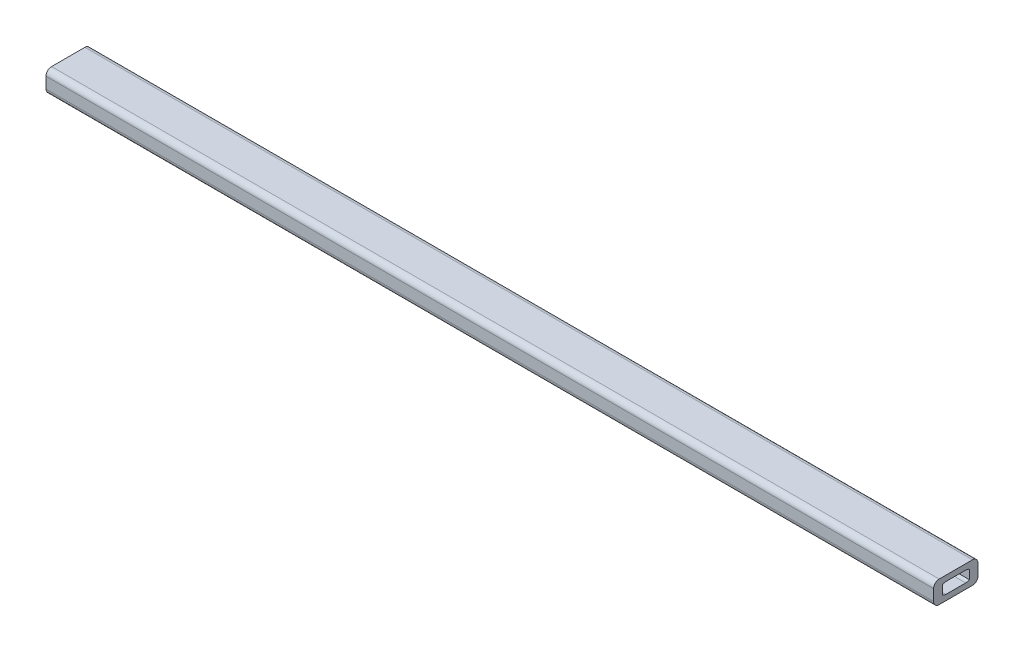
ISO-10303-21;
HEADER;
FILE_DESCRIPTION(('STEP AP214'),'2;1');
FILE_NAME('part.step','',(''),(''),'','','');
FILE_SCHEMA(('AUTOMOTIVE_DESIGN { 1 0 10303 214 1 1 1 1 }'));
ENDSEC;
DATA;
#1=APPLICATION_CONTEXT('core data for automotive mechanical design processes');
#2=APPLICATION_PROTOCOL_DEFINITION('international standard','automotive_design',2000,#1);
#3=PRODUCT_CONTEXT('',#1,'mechanical');
#4=PRODUCT('Part','Part','',(#3));
#5=PRODUCT_RELATED_PRODUCT_CATEGORY('part','',(#4));
#6=PRODUCT_DEFINITION_FORMATION('','',#4);
#7=PRODUCT_DEFINITION_CONTEXT('part definition',#1,'design');
#8=PRODUCT_DEFINITION('design','',#6,#7);
#9=PRODUCT_DEFINITION_SHAPE('','',#8);
#10=(LENGTH_UNIT() NAMED_UNIT(*) SI_UNIT(.MILLI.,.METRE.));
#11=(NAMED_UNIT(*) PLANE_ANGLE_UNIT() SI_UNIT($,.RADIAN.));
#12=(NAMED_UNIT(*) SI_UNIT($,.STERADIAN.) SOLID_ANGLE_UNIT());
#13=UNCERTAINTY_MEASURE_WITH_UNIT(LENGTH_MEASURE(1.E-05),#10,'distance_accuracy_value','');
#14=(GEOMETRIC_REPRESENTATION_CONTEXT(3) GLOBAL_UNCERTAINTY_ASSIGNED_CONTEXT((#13)) GLOBAL_UNIT_ASSIGNED_CONTEXT((#10,
#11,#12)) REPRESENTATION_CONTEXT('',''));
#15=CARTESIAN_POINT('',(0.,0.,0.));
#16=DIRECTION('',(0.,0.,1.));
#17=DIRECTION('',(1.,0.,0.));
#18=AXIS2_PLACEMENT_3D('',#15,#16,#17);
#19=CARTESIAN_POINT('',(400.,5.,15.));
#20=DIRECTION('',(-1.,0.,0.));
#21=DIRECTION('',(0.,0.,1.));
#22=AXIS2_PLACEMENT_3D('',#19,#20,#21);
#23=PLANE('',#22);
#24=CARTESIAN_POINT('',(400.,5.,15.));
#25=DIRECTION('',(1.,0.,0.));
#26=DIRECTION('',(0.,0.,1.));
#27=AXIS2_PLACEMENT_3D('',#24,#25,#26);
#28=CIRCLE('',#27,5.);
#29=CARTESIAN_POINT('',(400.,10.,15.));
#30=VERTEX_POINT('',#29);
#31=CARTESIAN_POINT('',(400.,5.,20.));
#32=VERTEX_POINT('',#31);
#33=EDGE_CURVE('E242',#30,#32,#28,.T.);
#34=ORIENTED_EDGE('',*,*,#33,.T.);
#35=DIRECTION('',(0.,-1.,0.));
#36=VECTOR('',#35,1.);
#37=CARTESIAN_POINT('',(400.,5.,20.));
#38=LINE('',#37,#36);
#39=CARTESIAN_POINT('',(400.,-5.,20.));
#40=VERTEX_POINT('',#39);
#41=EDGE_CURVE('E246',#32,#40,#38,.T.);
#42=ORIENTED_EDGE('',*,*,#41,.T.);
#43=CARTESIAN_POINT('',(400.,-5.,15.));
#44=DIRECTION('',(1.,0.,0.));
#45=DIRECTION('',(0.,0.,-1.));
#46=AXIS2_PLACEMENT_3D('',#43,#44,#45);
#47=CIRCLE('',#46,5.);
#48=CARTESIAN_POINT('',(400.,-10.,15.));
#49=VERTEX_POINT('',#48);
#50=EDGE_CURVE('E250',#40,#49,#47,.T.);
#51=ORIENTED_EDGE('',*,*,#50,.T.);
#52=DIRECTION('',(0.,0.,-1.));
#53=VECTOR('',#52,1.);
#54=CARTESIAN_POINT('',(400.,-10.,15.));
#55=LINE('',#54,#53);
#56=CARTESIAN_POINT('',(400.,-10.,-15.));
#57=VERTEX_POINT('',#56);
#58=EDGE_CURVE('E253',#49,#57,#55,.T.);
#59=ORIENTED_EDGE('',*,*,#58,.T.);
#60=CARTESIAN_POINT('',(400.,-5.,-15.));
#61=DIRECTION('',(1.,0.,0.));
#62=DIRECTION('',(0.,0.,-1.));
#63=AXIS2_PLACEMENT_3D('',#60,#61,#62);
#64=CIRCLE('',#63,5.);
#65=CARTESIAN_POINT('',(400.,-5.,-20.));
#66=VERTEX_POINT('',#65);
#67=EDGE_CURVE('E256',#57,#66,#64,.T.);
#68=ORIENTED_EDGE('',*,*,#67,.T.);
#69=DIRECTION('',(0.,1.,0.));
#70=VECTOR('',#69,1.);
#71=CARTESIAN_POINT('',(400.,5.,-20.));
#72=LINE('',#71,#70);
#73=CARTESIAN_POINT('',(400.,5.,-20.));
#74=VERTEX_POINT('',#73);
#75=EDGE_CURVE('E259',#66,#74,#72,.T.);
#76=ORIENTED_EDGE('',*,*,#75,.T.);
#77=CARTESIAN_POINT('',(400.,5.,-15.));
#78=DIRECTION('',(1.,0.,0.));
#79=DIRECTION('',(0.,0.,-1.));
#80=AXIS2_PLACEMENT_3D('',#77,#78,#79);
#81=CIRCLE('',#80,5.);
#82=CARTESIAN_POINT('',(400.,10.,-15.));
#83=VERTEX_POINT('',#82);
#84=EDGE_CURVE('E262',#74,#83,#81,.T.);
#85=ORIENTED_EDGE('',*,*,#84,.T.);
#86=DIRECTION('',(0.,0.,1.));
#87=VECTOR('',#86,1.);
#88=CARTESIAN_POINT('',(400.,10.,15.));
#89=LINE('',#88,#87);
#90=EDGE_CURVE('E265',#83,#30,#89,.T.);
#91=ORIENTED_EDGE('',*,*,#90,.T.);
#92=EDGE_LOOP('',(#34,#42,#51,#59,#68,#76,#85,#91));
#93=FACE_BOUND('',#92,.T.);
#94=CARTESIAN_POINT('',(400.,-1.12966798087694,-8.87033201912305));
#95=DIRECTION('',(1.,0.,0.));
#96=DIRECTION('',(0.,0.,-1.));
#97=AXIS2_PLACEMENT_3D('',#94,#95,#96);
#98=CIRCLE('',#97,6.12966798087693);
#99=CARTESIAN_POINT('',(400.,4.04958869223167,-12.148766076695));
#100=VERTEX_POINT('',#99);
#101=CARTESIAN_POINT('',(400.,5.,-8.87033201912305));
#102=VERTEX_POINT('',#101);
#103=EDGE_CURVE('E153',#100,#102,#98,.T.);
#104=ORIENTED_EDGE('',*,*,#103,.F.);
#105=DIRECTION('',(0.,1.,0.));
#106=VECTOR('',#105,1.);
#107=CARTESIAN_POINT('',(400.,4.04958869223167,-12.148766076695));
#108=LINE('',#107,#106);
#109=CARTESIAN_POINT('',(400.,-4.04958869223169,-12.148766076695));
#110=VERTEX_POINT('',#109);
#111=EDGE_CURVE('E194',#110,#100,#108,.T.);
#112=ORIENTED_EDGE('',*,*,#111,.F.);
#113=CARTESIAN_POINT('',(400.,1.12966798087693,-8.87033201912305));
#114=DIRECTION('',(1.,0.,0.));
#115=DIRECTION('',(0.,0.,1.));
#116=AXIS2_PLACEMENT_3D('',#113,#114,#115);
#117=CIRCLE('',#116,6.12966798087693);
#118=CARTESIAN_POINT('',(400.,-5.00000000000001,-8.87033201912305));
#119=VERTEX_POINT('',#118);
#120=EDGE_CURVE('E191',#119,#110,#117,.T.);
#121=ORIENTED_EDGE('',*,*,#120,.F.);
#122=DIRECTION('',(0.,0.,-1.));
#123=VECTOR('',#122,1.);
#124=CARTESIAN_POINT('',(400.,-5.00000000000001,8.87033201912308));
#125=LINE('',#124,#123);
#126=CARTESIAN_POINT('',(400.,-5.00000000000001,8.87033201912308));
#127=VERTEX_POINT('',#126);
#128=EDGE_CURVE('E188',#127,#119,#125,.T.);
#129=ORIENTED_EDGE('',*,*,#128,.F.);
#130=CARTESIAN_POINT('',(400.,1.12966798087693,8.87033201912308));
#131=DIRECTION('',(1.,0.,0.));
#132=DIRECTION('',(0.,0.,-1.));
#133=AXIS2_PLACEMENT_3D('',#130,#131,#132);
#134=CIRCLE('',#133,6.12966798087693);
#135=CARTESIAN_POINT('',(400.,-4.04958869223168,12.1487660766951));
#136=VERTEX_POINT('',#135);
#137=EDGE_CURVE('E185',#136,#127,#134,.T.);
#138=ORIENTED_EDGE('',*,*,#137,.F.);
#139=DIRECTION('',(0.,-1.,0.));
#140=VECTOR('',#139,1.);
#141=CARTESIAN_POINT('',(400.,4.04958869223168,12.1487660766951));
#142=LINE('',#141,#140);
#143=CARTESIAN_POINT('',(400.,4.04958869223168,12.1487660766951));
#144=VERTEX_POINT('',#143);
#145=EDGE_CURVE('E180',#144,#136,#142,.T.);
#146=ORIENTED_EDGE('',*,*,#145,.F.);
#147=CARTESIAN_POINT('',(400.,-1.12966798087694,8.87033201912308));
#148=DIRECTION('',(1.,0.,0.));
#149=DIRECTION('',(0.,0.,1.));
#150=AXIS2_PLACEMENT_3D('',#147,#148,#149);
#151=CIRCLE('',#150,6.12966798087693);
#152=CARTESIAN_POINT('',(400.,5.,8.87033201912308));
#153=VERTEX_POINT('',#152);
#154=EDGE_CURVE('E176',#153,#144,#151,.T.);
#155=ORIENTED_EDGE('',*,*,#154,.F.);
#156=DIRECTION('',(0.,0.,1.));
#157=VECTOR('',#156,1.);
#158=CARTESIAN_POINT('',(400.,5.,8.87033201912308));
#159=LINE('',#158,#157);
#160=EDGE_CURVE('E162',#102,#153,#159,.T.);
#161=ORIENTED_EDGE('',*,*,#160,.F.);
#162=EDGE_LOOP('',(#104,#112,#121,#129,#138,#146,#155,#161));
#163=FACE_BOUND('',#162,.T.);
#164=ADVANCED_FACE('F39',(#93,#163),#23,.F.);
#165=CARTESIAN_POINT('',(-400.,5.,15.));
#166=DIRECTION('',(-1.,0.,0.));
#167=DIRECTION('',(0.,0.,1.));
#168=AXIS2_PLACEMENT_3D('',#165,#166,#167);
#169=PLANE('',#168);
#170=CARTESIAN_POINT('',(-400.,5.,15.));
#171=DIRECTION('',(1.,0.,0.));
#172=DIRECTION('',(0.,0.,1.));
#173=AXIS2_PLACEMENT_3D('',#170,#171,#172);
#174=CIRCLE('',#173,5.);
#175=CARTESIAN_POINT('',(-400.,10.,15.));
#176=VERTEX_POINT('',#175);
#177=CARTESIAN_POINT('',(-400.,5.,20.));
#178=VERTEX_POINT('',#177);
#179=EDGE_CURVE('E171',#176,#178,#174,.T.);
#180=ORIENTED_EDGE('',*,*,#179,.F.);
#181=DIRECTION('',(0.,0.,1.));
#182=VECTOR('',#181,1.);
#183=CARTESIAN_POINT('',(-400.,10.,15.));
#184=LINE('',#183,#182);
#185=CARTESIAN_POINT('',(-400.,10.,-15.));
#186=VERTEX_POINT('',#185);
#187=EDGE_CURVE('E247',#186,#176,#184,.T.);
#188=ORIENTED_EDGE('',*,*,#187,.F.);
#189=CARTESIAN_POINT('',(-400.,5.,-15.));
#190=DIRECTION('',(1.,0.,0.));
#191=DIRECTION('',(0.,0.,-1.));
#192=AXIS2_PLACEMENT_3D('',#189,#190,#191);
#193=CIRCLE('',#192,5.);
#194=CARTESIAN_POINT('',(-400.,5.,-20.));
#195=VERTEX_POINT('',#194);
#196=EDGE_CURVE('E287',#195,#186,#193,.T.);
#197=ORIENTED_EDGE('',*,*,#196,.F.);
#198=DIRECTION('',(0.,1.,0.));
#199=VECTOR('',#198,1.);
#200=CARTESIAN_POINT('',(-400.,5.,-20.));
#201=LINE('',#200,#199);
#202=CARTESIAN_POINT('',(-400.,-5.,-20.));
#203=VERTEX_POINT('',#202);
#204=EDGE_CURVE('E284',#203,#195,#201,.T.);
#205=ORIENTED_EDGE('',*,*,#204,.F.);
#206=CARTESIAN_POINT('',(-400.,-5.,-15.));
#207=DIRECTION('',(1.,0.,0.));
#208=DIRECTION('',(0.,0.,-1.));
#209=AXIS2_PLACEMENT_3D('',#206,#207,#208);
#210=CIRCLE('',#209,5.);
#211=CARTESIAN_POINT('',(-400.,-10.,-15.));
#212=VERTEX_POINT('',#211);
#213=EDGE_CURVE('E281',#212,#203,#210,.T.);
#214=ORIENTED_EDGE('',*,*,#213,.F.);
#215=DIRECTION('',(0.,0.,-1.));
#216=VECTOR('',#215,1.);
#217=CARTESIAN_POINT('',(-400.,-10.,15.));
#218=LINE('',#217,#216);
#219=CARTESIAN_POINT('',(-400.,-10.,15.));
#220=VERTEX_POINT('',#219);
#221=EDGE_CURVE('E278',#220,#212,#218,.T.);
#222=ORIENTED_EDGE('',*,*,#221,.F.);
#223=CARTESIAN_POINT('',(-400.,-5.,15.));
#224=DIRECTION('',(1.,0.,0.));
#225=DIRECTION('',(0.,0.,-1.));
#226=AXIS2_PLACEMENT_3D('',#223,#224,#225);
#227=CIRCLE('',#226,5.);
#228=CARTESIAN_POINT('',(-400.,-5.,20.));
#229=VERTEX_POINT('',#228);
#230=EDGE_CURVE('E275',#229,#220,#227,.T.);
#231=ORIENTED_EDGE('',*,*,#230,.F.);
#232=DIRECTION('',(0.,-1.,0.));
#233=VECTOR('',#232,1.);
#234=CARTESIAN_POINT('',(-400.,5.,20.));
#235=LINE('',#234,#233);
#236=EDGE_CURVE('E272',#178,#229,#235,.T.);
#237=ORIENTED_EDGE('',*,*,#236,.F.);
#238=EDGE_LOOP('',(#180,#188,#197,#205,#214,#222,#231,#237));
#239=FACE_BOUND('',#238,.T.);
#240=DIRECTION('',(0.,1.,0.));
#241=VECTOR('',#240,1.);
#242=CARTESIAN_POINT('',(-400.,4.04958869223167,-12.148766076695));
#243=LINE('',#242,#241);
#244=CARTESIAN_POINT('',(-400.,-4.04958869223169,-12.148766076695));
#245=VERTEX_POINT('',#244);
#246=CARTESIAN_POINT('',(-400.,4.04958869223167,-12.148766076695));
#247=VERTEX_POINT('',#246);
#248=EDGE_CURVE('E163',#245,#247,#243,.T.);
#249=ORIENTED_EDGE('',*,*,#248,.T.);
#250=CARTESIAN_POINT('',(-400.,-1.12966798087694,-8.87033201912305));
#251=DIRECTION('',(1.,0.,0.));
#252=DIRECTION('',(0.,0.,-1.));
#253=AXIS2_PLACEMENT_3D('',#250,#251,#252);
#254=CIRCLE('',#253,6.12966798087693);
#255=CARTESIAN_POINT('',(-400.,5.,-8.87033201912305));
#256=VERTEX_POINT('',#255);
#257=EDGE_CURVE('E63',#247,#256,#254,.T.);
#258=ORIENTED_EDGE('',*,*,#257,.T.);
#259=DIRECTION('',(0.,0.,1.));
#260=VECTOR('',#259,1.);
#261=CARTESIAN_POINT('',(-400.,5.,8.87033201912308));
#262=LINE('',#261,#260);
#263=CARTESIAN_POINT('',(-400.,5.,8.87033201912308));
#264=VERTEX_POINT('',#263);
#265=EDGE_CURVE('E169',#256,#264,#262,.T.);
#266=ORIENTED_EDGE('',*,*,#265,.T.);
#267=CARTESIAN_POINT('',(-400.,-1.12966798087694,8.87033201912308));
#268=DIRECTION('',(1.,0.,0.));
#269=DIRECTION('',(0.,0.,1.));
#270=AXIS2_PLACEMENT_3D('',#267,#268,#269);
#271=CIRCLE('',#270,6.12966798087693);
#272=CARTESIAN_POINT('',(-400.,4.04958869223168,12.1487660766951));
#273=VERTEX_POINT('',#272);
#274=EDGE_CURVE('E201',#264,#273,#271,.T.);
#275=ORIENTED_EDGE('',*,*,#274,.T.);
#276=DIRECTION('',(0.,-1.,0.));
#277=VECTOR('',#276,1.);
#278=CARTESIAN_POINT('',(-400.,4.04958869223168,12.1487660766951));
#279=LINE('',#278,#277);
#280=CARTESIAN_POINT('',(-400.,-4.04958869223168,12.1487660766951));
#281=VERTEX_POINT('',#280);
#282=EDGE_CURVE('E205',#273,#281,#279,.T.);
#283=ORIENTED_EDGE('',*,*,#282,.T.);
#284=CARTESIAN_POINT('',(-400.,1.12966798087693,8.87033201912308));
#285=DIRECTION('',(1.,0.,0.));
#286=DIRECTION('',(0.,0.,-1.));
#287=AXIS2_PLACEMENT_3D('',#284,#285,#286);
#288=CIRCLE('',#287,6.12966798087693);
#289=CARTESIAN_POINT('',(-400.,-5.00000000000001,8.87033201912308));
#290=VERTEX_POINT('',#289);
#291=EDGE_CURVE('E209',#281,#290,#288,.T.);
#292=ORIENTED_EDGE('',*,*,#291,.T.);
#293=DIRECTION('',(0.,0.,-1.));
#294=VECTOR('',#293,1.);
#295=CARTESIAN_POINT('',(-400.,-5.00000000000001,8.87033201912308));
#296=LINE('',#295,#294);
#297=CARTESIAN_POINT('',(-400.,-5.00000000000001,-8.87033201912305));
#298=VERTEX_POINT('',#297);
#299=EDGE_CURVE('E213',#290,#298,#296,.T.);
#300=ORIENTED_EDGE('',*,*,#299,.T.);
#301=CARTESIAN_POINT('',(-400.,1.12966798087693,-8.87033201912305));
#302=DIRECTION('',(1.,0.,0.));
#303=DIRECTION('',(0.,0.,1.));
#304=AXIS2_PLACEMENT_3D('',#301,#302,#303);
#305=CIRCLE('',#304,6.12966798087693);
#306=EDGE_CURVE('E217',#298,#245,#305,.T.);
#307=ORIENTED_EDGE('',*,*,#306,.T.);
#308=EDGE_LOOP('',(#249,#258,#266,#275,#283,#292,#300,#307));
#309=FACE_BOUND('',#308,.T.);
#310=ADVANCED_FACE('F326',(#239,#309),#169,.T.);
#311=CARTESIAN_POINT('',(400.,5.,15.));
#312=DIRECTION('',(-1.,0.,0.));
#313=DIRECTION('',(0.,0.,1.));
#314=AXIS2_PLACEMENT_3D('',#311,#312,#313);
#315=CYLINDRICAL_SURFACE('',#314,5.);
#316=ORIENTED_EDGE('',*,*,#179,.T.);
#317=DIRECTION('',(-1.,0.,0.));
#318=VECTOR('',#317,1.);
#319=CARTESIAN_POINT('',(400.,5.,20.));
#320=LINE('',#319,#318);
#321=EDGE_CURVE('E11',#32,#178,#320,.T.);
#322=ORIENTED_EDGE('',*,*,#321,.F.);
#323=ORIENTED_EDGE('',*,*,#33,.F.);
#324=DIRECTION('',(-1.,0.,0.));
#325=VECTOR('',#324,1.);
#326=CARTESIAN_POINT('',(400.,10.,15.));
#327=LINE('',#326,#325);
#328=EDGE_CURVE('E268',#30,#176,#327,.T.);
#329=ORIENTED_EDGE('',*,*,#328,.T.);
#330=EDGE_LOOP('',(#316,#322,#323,#329));
#331=FACE_BOUND('',#330,.T.);
#332=ADVANCED_FACE('F41',(#331),#315,.T.);
#333=CARTESIAN_POINT('',(400.,5.,20.));
#334=DIRECTION('',(0.,0.,-1.));
#335=DIRECTION('',(0.,1.,0.));
#336=AXIS2_PLACEMENT_3D('',#333,#334,#335);
#337=PLANE('',#336);
#338=ORIENTED_EDGE('',*,*,#236,.T.);
#339=DIRECTION('',(-1.,0.,0.));
#340=VECTOR('',#339,1.);
#341=CARTESIAN_POINT('',(400.,-5.,20.));
#342=LINE('',#341,#340);
#343=EDGE_CURVE('E48',#40,#229,#342,.T.);
#344=ORIENTED_EDGE('',*,*,#343,.F.);
#345=ORIENTED_EDGE('',*,*,#41,.F.);
#346=ORIENTED_EDGE('',*,*,#321,.T.);
#347=EDGE_LOOP('',(#338,#344,#345,#346));
#348=FACE_BOUND('',#347,.T.);
#349=ADVANCED_FACE('F343',(#348),#337,.F.);
#350=CARTESIAN_POINT('',(400.,-5.,15.));
#351=DIRECTION('',(-1.,0.,0.));
#352=DIRECTION('',(0.,0.,1.));
#353=AXIS2_PLACEMENT_3D('',#350,#351,#352);
#354=CYLINDRICAL_SURFACE('',#353,5.);
#355=ORIENTED_EDGE('',*,*,#230,.T.);
#356=DIRECTION('',(-1.,0.,0.));
#357=VECTOR('',#356,1.);
#358=CARTESIAN_POINT('',(400.,-10.,15.));
#359=LINE('',#358,#357);
#360=EDGE_CURVE('E311',#49,#220,#359,.T.);
#361=ORIENTED_EDGE('',*,*,#360,.F.);
#362=ORIENTED_EDGE('',*,*,#50,.F.);
#363=ORIENTED_EDGE('',*,*,#343,.T.);
#364=EDGE_LOOP('',(#355,#361,#362,#363));
#365=FACE_BOUND('',#364,.T.);
#366=ADVANCED_FACE('F320',(#365),#354,.T.);
#367=CARTESIAN_POINT('',(400.,-10.,15.));
#368=DIRECTION('',(0.,1.,0.));
#369=DIRECTION('',(0.,0.,1.));
#370=AXIS2_PLACEMENT_3D('',#367,#368,#369);
#371=PLANE('',#370);
#372=ORIENTED_EDGE('',*,*,#221,.T.);
#373=DIRECTION('',(-1.,0.,0.));
#374=VECTOR('',#373,1.);
#375=CARTESIAN_POINT('',(400.,-10.,-15.));
#376=LINE('',#375,#374);
#377=EDGE_CURVE('E307',#57,#212,#376,.T.);
#378=ORIENTED_EDGE('',*,*,#377,.F.);
#379=ORIENTED_EDGE('',*,*,#58,.F.);
#380=ORIENTED_EDGE('',*,*,#360,.T.);
#381=EDGE_LOOP('',(#372,#378,#379,#380));
#382=FACE_BOUND('',#381,.T.);
#383=ADVANCED_FACE('F332',(#382),#371,.F.);
#384=CARTESIAN_POINT('',(400.,-5.,-15.));
#385=DIRECTION('',(-1.,0.,0.));
#386=DIRECTION('',(0.,0.,1.));
#387=AXIS2_PLACEMENT_3D('',#384,#385,#386);
#388=CYLINDRICAL_SURFACE('',#387,5.);
#389=ORIENTED_EDGE('',*,*,#213,.T.);
#390=DIRECTION('',(-1.,0.,0.));
#391=VECTOR('',#390,1.);
#392=CARTESIAN_POINT('',(400.,-5.,-20.));
#393=LINE('',#392,#391);
#394=EDGE_CURVE('E303',#66,#203,#393,.T.);
#395=ORIENTED_EDGE('',*,*,#394,.F.);
#396=ORIENTED_EDGE('',*,*,#67,.F.);
#397=ORIENTED_EDGE('',*,*,#377,.T.);
#398=EDGE_LOOP('',(#389,#395,#396,#397));
#399=FACE_BOUND('',#398,.T.);
#400=ADVANCED_FACE('F336',(#399),#388,.T.);
#401=CARTESIAN_POINT('',(400.,5.,-20.));
#402=DIRECTION('',(0.,0.,1.));
#403=DIRECTION('',(0.,-1.,0.));
#404=AXIS2_PLACEMENT_3D('',#401,#402,#403);
#405=PLANE('',#404);
#406=ORIENTED_EDGE('',*,*,#204,.T.);
#407=DIRECTION('',(-1.,0.,0.));
#408=VECTOR('',#407,1.);
#409=CARTESIAN_POINT('',(400.,5.,-20.));
#410=LINE('',#409,#408);
#411=EDGE_CURVE('E299',#74,#195,#410,.T.);
#412=ORIENTED_EDGE('',*,*,#411,.F.);
#413=ORIENTED_EDGE('',*,*,#75,.F.);
#414=ORIENTED_EDGE('',*,*,#394,.T.);
#415=EDGE_LOOP('',(#406,#412,#413,#414));
#416=FACE_BOUND('',#415,.T.);
#417=ADVANCED_FACE('F356',(#416),#405,.F.);
#418=CARTESIAN_POINT('',(400.,5.,-15.));
#419=DIRECTION('',(-1.,0.,0.));
#420=DIRECTION('',(0.,0.,1.));
#421=AXIS2_PLACEMENT_3D('',#418,#419,#420);
#422=CYLINDRICAL_SURFACE('',#421,5.);
#423=ORIENTED_EDGE('',*,*,#196,.T.);
#424=DIRECTION('',(-1.,0.,0.));
#425=VECTOR('',#424,1.);
#426=CARTESIAN_POINT('',(400.,10.,-15.));
#427=LINE('',#426,#425);
#428=EDGE_CURVE('E295',#83,#186,#427,.T.);
#429=ORIENTED_EDGE('',*,*,#428,.F.);
#430=ORIENTED_EDGE('',*,*,#84,.F.);
#431=ORIENTED_EDGE('',*,*,#411,.T.);
#432=EDGE_LOOP('',(#423,#429,#430,#431));
#433=FACE_BOUND('',#432,.T.);
#434=ADVANCED_FACE('F354',(#433),#422,.T.);
#435=CARTESIAN_POINT('',(400.,10.,15.));
#436=DIRECTION('',(0.,-1.,0.));
#437=DIRECTION('',(0.,0.,-1.));
#438=AXIS2_PLACEMENT_3D('',#435,#436,#437);
#439=PLANE('',#438);
#440=ORIENTED_EDGE('',*,*,#187,.T.);
#441=ORIENTED_EDGE('',*,*,#328,.F.);
#442=ORIENTED_EDGE('',*,*,#90,.F.);
#443=ORIENTED_EDGE('',*,*,#428,.T.);
#444=EDGE_LOOP('',(#440,#441,#442,#443));
#445=FACE_BOUND('',#444,.T.);
#446=ADVANCED_FACE('F349',(#445),#439,.F.);
#447=CARTESIAN_POINT('',(400.,-1.12966798087694,-8.87033201912305));
#448=DIRECTION('',(-1.,0.,0.));
#449=DIRECTION('',(0.,0.,1.));
#450=AXIS2_PLACEMENT_3D('',#447,#448,#449);
#451=CYLINDRICAL_SURFACE('',#450,6.12966798087693);
#452=ORIENTED_EDGE('',*,*,#257,.F.);
#453=DIRECTION('',(-1.,0.,0.));
#454=VECTOR('',#453,1.);
#455=CARTESIAN_POINT('',(400.,4.04958869223167,-12.148766076695));
#456=LINE('',#455,#454);
#457=EDGE_CURVE('E157',#100,#247,#456,.T.);
#458=ORIENTED_EDGE('',*,*,#457,.F.);
#459=ORIENTED_EDGE('',*,*,#103,.T.);
#460=DIRECTION('',(-1.,0.,0.));
#461=VECTOR('',#460,1.);
#462=CARTESIAN_POINT('',(400.,5.,-8.87033201912305));
#463=LINE('',#462,#461);
#464=EDGE_CURVE('E156',#102,#256,#463,.T.);
#465=ORIENTED_EDGE('',*,*,#464,.T.);
#466=EDGE_LOOP('',(#452,#458,#459,#465));
#467=FACE_BOUND('',#466,.T.);
#468=ADVANCED_FACE('F155',(#467),#451,.F.);
#469=CARTESIAN_POINT('',(400.,5.,8.87033201912308));
#470=DIRECTION('',(0.,-1.,0.));
#471=DIRECTION('',(0.,0.,-1.));
#472=AXIS2_PLACEMENT_3D('',#469,#470,#471);
#473=PLANE('',#472);
#474=ORIENTED_EDGE('',*,*,#265,.F.);
#475=ORIENTED_EDGE('',*,*,#464,.F.);
#476=ORIENTED_EDGE('',*,*,#160,.T.);
#477=DIRECTION('',(-1.,0.,0.));
#478=VECTOR('',#477,1.);
#479=CARTESIAN_POINT('',(400.,5.,8.87033201912308));
#480=LINE('',#479,#478);
#481=EDGE_CURVE('E172',#153,#264,#480,.T.);
#482=ORIENTED_EDGE('',*,*,#481,.T.);
#483=EDGE_LOOP('',(#474,#475,#476,#482));
#484=FACE_BOUND('',#483,.T.);
#485=ADVANCED_FACE('F166',(#484),#473,.T.);
#486=CARTESIAN_POINT('',(400.,-1.12966798087694,8.87033201912308));
#487=DIRECTION('',(-1.,0.,0.));
#488=DIRECTION('',(0.,0.,1.));
#489=AXIS2_PLACEMENT_3D('',#486,#487,#488);
#490=CYLINDRICAL_SURFACE('',#489,6.12966798087693);
#491=ORIENTED_EDGE('',*,*,#274,.F.);
#492=ORIENTED_EDGE('',*,*,#481,.F.);
#493=ORIENTED_EDGE('',*,*,#154,.T.);
#494=DIRECTION('',(-1.,0.,0.));
#495=VECTOR('',#494,1.);
#496=CARTESIAN_POINT('',(400.,4.04958869223168,12.1487660766951));
#497=LINE('',#496,#495);
#498=EDGE_CURVE('E237',#144,#273,#497,.T.);
#499=ORIENTED_EDGE('',*,*,#498,.T.);
#500=EDGE_LOOP('',(#491,#492,#493,#499));
#501=FACE_BOUND('',#500,.T.);
#502=ADVANCED_FACE('F381',(#501),#490,.F.);
#503=CARTESIAN_POINT('',(400.,4.04958869223168,12.1487660766951));
#504=DIRECTION('',(0.,0.,-1.));
#505=DIRECTION('',(-1.,0.,0.));
#506=AXIS2_PLACEMENT_3D('',#503,#504,#505);
#507=PLANE('',#506);
#508=ORIENTED_EDGE('',*,*,#282,.F.);
#509=ORIENTED_EDGE('',*,*,#498,.F.);
#510=ORIENTED_EDGE('',*,*,#145,.T.);
#511=DIRECTION('',(-1.,0.,0.));
#512=VECTOR('',#511,1.);
#513=CARTESIAN_POINT('',(400.,-4.04958869223168,12.1487660766951));
#514=LINE('',#513,#512);
#515=EDGE_CURVE('E234',#136,#281,#514,.T.);
#516=ORIENTED_EDGE('',*,*,#515,.T.);
#517=EDGE_LOOP('',(#508,#509,#510,#516));
#518=FACE_BOUND('',#517,.T.);
#519=ADVANCED_FACE('F385',(#518),#507,.T.);
#520=CARTESIAN_POINT('',(400.,1.12966798087693,8.87033201912308));
#521=DIRECTION('',(-1.,0.,0.));
#522=DIRECTION('',(0.,0.,1.));
#523=AXIS2_PLACEMENT_3D('',#520,#521,#522);
#524=CYLINDRICAL_SURFACE('',#523,6.12966798087693);
#525=ORIENTED_EDGE('',*,*,#291,.F.);
#526=ORIENTED_EDGE('',*,*,#515,.F.);
#527=ORIENTED_EDGE('',*,*,#137,.T.);
#528=DIRECTION('',(-1.,0.,0.));
#529=VECTOR('',#528,1.);
#530=CARTESIAN_POINT('',(400.,-5.00000000000001,8.87033201912308));
#531=LINE('',#530,#529);
#532=EDGE_CURVE('E231',#127,#290,#531,.T.);
#533=ORIENTED_EDGE('',*,*,#532,.T.);
#534=EDGE_LOOP('',(#525,#526,#527,#533));
#535=FACE_BOUND('',#534,.T.);
#536=ADVANCED_FACE('F391',(#535),#524,.F.);
#537=CARTESIAN_POINT('',(400.,-5.00000000000001,8.87033201912308));
#538=DIRECTION('',(0.,1.,0.));
#539=DIRECTION('',(0.,0.,1.));
#540=AXIS2_PLACEMENT_3D('',#537,#538,#539);
#541=PLANE('',#540);
#542=ORIENTED_EDGE('',*,*,#299,.F.);
#543=ORIENTED_EDGE('',*,*,#532,.F.);
#544=ORIENTED_EDGE('',*,*,#128,.T.);
#545=DIRECTION('',(-1.,0.,0.));
#546=VECTOR('',#545,1.);
#547=CARTESIAN_POINT('',(400.,-5.00000000000001,-8.87033201912305));
#548=LINE('',#547,#546);
#549=EDGE_CURVE('E228',#119,#298,#548,.T.);
#550=ORIENTED_EDGE('',*,*,#549,.T.);
#551=EDGE_LOOP('',(#542,#543,#544,#550));
#552=FACE_BOUND('',#551,.T.);
#553=ADVANCED_FACE('F395',(#552),#541,.T.);
#554=CARTESIAN_POINT('',(400.,1.12966798087693,-8.87033201912305));
#555=DIRECTION('',(-1.,0.,0.));
#556=DIRECTION('',(0.,0.,1.));
#557=AXIS2_PLACEMENT_3D('',#554,#555,#556);
#558=CYLINDRICAL_SURFACE('',#557,6.12966798087693);
#559=ORIENTED_EDGE('',*,*,#306,.F.);
#560=ORIENTED_EDGE('',*,*,#549,.F.);
#561=ORIENTED_EDGE('',*,*,#120,.T.);
#562=DIRECTION('',(-1.,0.,0.));
#563=VECTOR('',#562,1.);
#564=CARTESIAN_POINT('',(400.,-4.04958869223169,-12.148766076695));
#565=LINE('',#564,#563);
#566=EDGE_CURVE('E55',#110,#245,#565,.T.);
#567=ORIENTED_EDGE('',*,*,#566,.T.);
#568=EDGE_LOOP('',(#559,#560,#561,#567));
#569=FACE_BOUND('',#568,.T.);
#570=ADVANCED_FACE('F399',(#569),#558,.F.);
#571=CARTESIAN_POINT('',(400.,4.04958869223167,-12.148766076695));
#572=DIRECTION('',(0.,0.,1.));
#573=DIRECTION('',(0.,-1.,0.));
#574=AXIS2_PLACEMENT_3D('',#571,#572,#573);
#575=PLANE('',#574);
#576=ORIENTED_EDGE('',*,*,#248,.F.);
#577=ORIENTED_EDGE('',*,*,#566,.F.);
#578=ORIENTED_EDGE('',*,*,#111,.T.);
#579=ORIENTED_EDGE('',*,*,#457,.T.);
#580=EDGE_LOOP('',(#576,#577,#578,#579));
#581=FACE_BOUND('',#580,.T.);
#582=ADVANCED_FACE('F403',(#581),#575,.T.);
#583=CLOSED_SHELL('',(#164,#310,#332,#349,#366,#383,#400,#417,#434,#446,#468,#485,#502,#519,
#536,#553,#570,#582));
#584=MANIFOLD_SOLID_BREP('B2',#583);
#585=ADVANCED_BREP_SHAPE_REPRESENTATION('',(#18,#584),#14);
#586=SHAPE_DEFINITION_REPRESENTATION(#9,#585);
ENDSEC;
END-ISO-10303-21;
